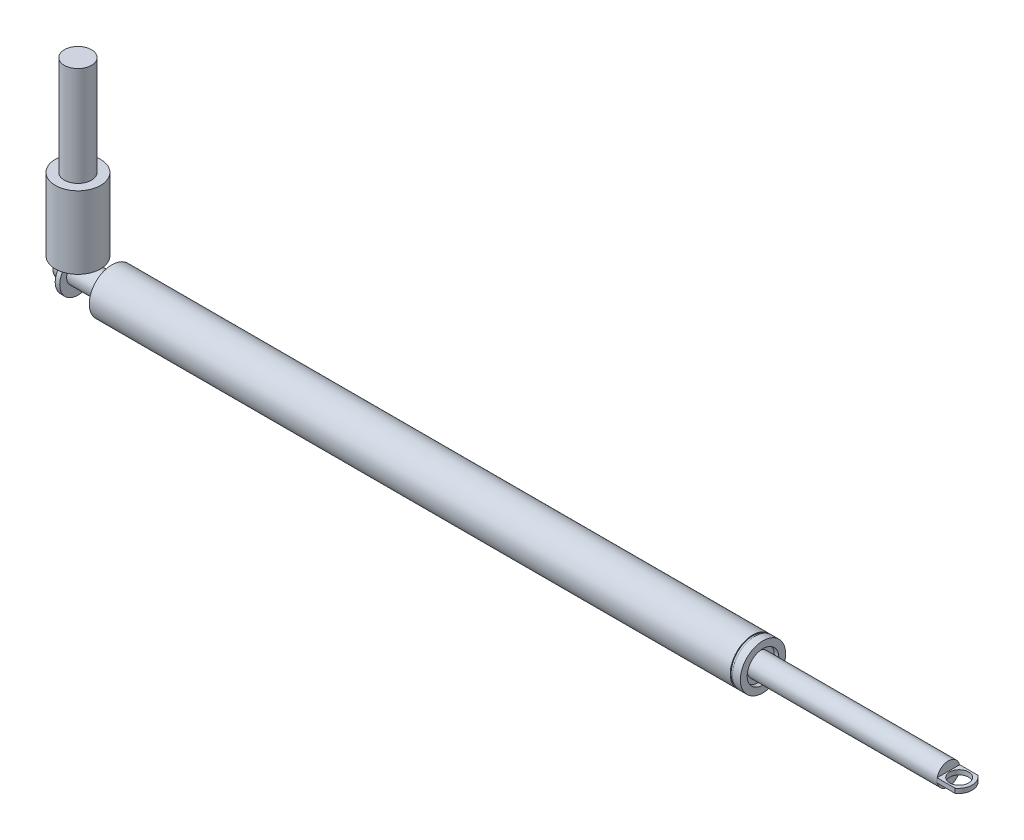
ISO-10303-21;
HEADER;
FILE_DESCRIPTION(('STEP AP214'),'2;1');
FILE_NAME('part.step','',(''),(''),'','','');
FILE_SCHEMA(('AUTOMOTIVE_DESIGN { 1 0 10303 214 1 1 1 1 }'));
ENDSEC;
DATA;
#1=APPLICATION_CONTEXT('core data for automotive mechanical design processes');
#2=APPLICATION_PROTOCOL_DEFINITION('international standard','automotive_design',2000,#1);
#3=PRODUCT_CONTEXT('',#1,'mechanical');
#4=PRODUCT('Part','Part','',(#3));
#5=PRODUCT_RELATED_PRODUCT_CATEGORY('part','',(#4));
#6=PRODUCT_DEFINITION_FORMATION('','',#4);
#7=PRODUCT_DEFINITION_CONTEXT('part definition',#1,'design');
#8=PRODUCT_DEFINITION('design','',#6,#7);
#9=PRODUCT_DEFINITION_SHAPE('','',#8);
#10=(LENGTH_UNIT() NAMED_UNIT(*) SI_UNIT(.MILLI.,.METRE.));
#11=(NAMED_UNIT(*) PLANE_ANGLE_UNIT() SI_UNIT($,.RADIAN.));
#12=(NAMED_UNIT(*) SI_UNIT($,.STERADIAN.) SOLID_ANGLE_UNIT());
#13=UNCERTAINTY_MEASURE_WITH_UNIT(LENGTH_MEASURE(1.E-05),#10,'distance_accuracy_value','');
#14=(GEOMETRIC_REPRESENTATION_CONTEXT(3) GLOBAL_UNCERTAINTY_ASSIGNED_CONTEXT((#13)) GLOBAL_UNIT_ASSIGNED_CONTEXT((#10,
#11,#12)) REPRESENTATION_CONTEXT('',''));
#15=CARTESIAN_POINT('',(0.,0.,0.));
#16=DIRECTION('',(0.,0.,1.));
#17=DIRECTION('',(1.,0.,0.));
#18=AXIS2_PLACEMENT_3D('',#15,#16,#17);
#19=CARTESIAN_POINT('',(151.5,12.,0.));
#20=DIRECTION('',(-1.,0.,0.));
#21=DIRECTION('',(0.,0.,1.));
#22=AXIS2_PLACEMENT_3D('',#19,#20,#21);
#23=CYLINDRICAL_SURFACE('',#22,5.);
#24=CARTESIAN_POINT('',(7.5,12.,0.));
#25=DIRECTION('',(1.,0.,0.));
#26=DIRECTION('',(0.,0.,-1.));
#27=AXIS2_PLACEMENT_3D('',#24,#25,#26);
#28=CIRCLE('',#27,5.);
#29=CARTESIAN_POINT('',(7.5,12.,-5.));
#30=VERTEX_POINT('',#29);
#31=EDGE_CURVE('E177',#30,#30,#28,.T.);
#32=ORIENTED_EDGE('',*,*,#31,.T.);
#33=EDGE_LOOP('',(#32));
#34=FACE_BOUND('',#33,.T.);
#35=CARTESIAN_POINT('',(149.25,12.,0.));
#36=DIRECTION('',(1.,0.,0.));
#37=DIRECTION('',(0.,0.,-1.));
#38=AXIS2_PLACEMENT_3D('',#35,#36,#37);
#39=CIRCLE('',#38,5.);
#40=CARTESIAN_POINT('',(149.25,12.,-5.));
#41=VERTEX_POINT('',#40);
#42=EDGE_CURVE('E47',#41,#41,#39,.T.);
#43=ORIENTED_EDGE('',*,*,#42,.F.);
#44=EDGE_LOOP('',(#43));
#45=FACE_BOUND('',#44,.T.);
#46=ADVANCED_FACE('F43',(#34,#45),#23,.T.);
#47=CARTESIAN_POINT('',(7.5,12.0524575726032,0.));
#48=DIRECTION('',(-1.,0.,0.));
#49=DIRECTION('',(0.,0.,1.));
#50=AXIS2_PLACEMENT_3D('',#47,#48,#49);
#51=CYLINDRICAL_SURFACE('',#50,2.5);
#52=CARTESIAN_POINT('',(7.5,12.0524575726032,0.));
#53=DIRECTION('',(1.,0.,0.));
#54=DIRECTION('',(0.,0.,-1.));
#55=AXIS2_PLACEMENT_3D('',#52,#53,#54);
#56=CIRCLE('',#55,2.5);
#57=CARTESIAN_POINT('',(7.5,12.0524575726032,-2.5));
#58=VERTEX_POINT('',#57);
#59=EDGE_CURVE('E253',#58,#58,#56,.T.);
#60=ORIENTED_EDGE('',*,*,#59,.F.);
#61=EDGE_LOOP('',(#60));
#62=FACE_BOUND('',#61,.T.);
#63=CARTESIAN_POINT('',(0.,12.0524575726032,0.));
#64=DIRECTION('',(1.,0.,0.));
#65=DIRECTION('',(0.,0.,-1.));
#66=AXIS2_PLACEMENT_3D('',#63,#64,#65);
#67=CIRCLE('',#66,2.5);
#68=CARTESIAN_POINT('',(0.,12.0524575726032,-2.5));
#69=VERTEX_POINT('',#68);
#70=EDGE_CURVE('E252',#69,#69,#67,.T.);
#71=ORIENTED_EDGE('',*,*,#70,.T.);
#72=EDGE_LOOP('',(#71));
#73=FACE_BOUND('',#72,.T.);
#74=ADVANCED_FACE('F45',(#62,#73),#51,.T.);
#75=CARTESIAN_POINT('',(0.,14.54754243,2.52885894715441));
#76=DIRECTION('',(-1.,0.,0.));
#77=DIRECTION('',(0.,0.,1.));
#78=AXIS2_PLACEMENT_3D('',#75,#76,#77);
#79=PLANE('',#78);
#80=ORIENTED_EDGE('',*,*,#70,.F.);
#81=EDGE_LOOP('',(#80));
#82=FACE_BOUND('',#81,.T.);
#83=CARTESIAN_POINT('',(0.,11.4250434308008,0.0288589471544053));
#84=DIRECTION('',(1.,0.,0.));
#85=DIRECTION('',(0.,0.,-1.));
#86=AXIS2_PLACEMENT_3D('',#83,#84,#85);
#87=CIRCLE('',#86,4.);
#88=CARTESIAN_POINT('',(0.,14.54754243,2.52885894715441));
#89=VERTEX_POINT('',#88);
#90=CARTESIAN_POINT('',(0.,14.54754243,-2.47114105284559));
#91=VERTEX_POINT('',#90);
#92=EDGE_CURVE('E192',#89,#91,#87,.T.);
#93=ORIENTED_EDGE('',*,*,#92,.T.);
#94=DIRECTION('',(0.,1.,0.));
#95=VECTOR('',#94,1.);
#96=CARTESIAN_POINT('',(0.,14.54754243,-2.47114105284559));
#97=LINE('',#96,#95);
#98=CARTESIAN_POINT('',(0.,14.94754243,-2.47114105284559));
#99=VERTEX_POINT('',#98);
#100=EDGE_CURVE('E222',#91,#99,#97,.T.);
#101=ORIENTED_EDGE('',*,*,#100,.T.);
#102=DIRECTION('',(0.,0.,1.));
#103=VECTOR('',#102,1.);
#104=CARTESIAN_POINT('',(0.,14.94754243,2.52885894715441));
#105=LINE('',#104,#103);
#106=CARTESIAN_POINT('',(0.,14.94754243,2.52885894715441));
#107=VERTEX_POINT('',#106);
#108=EDGE_CURVE('E212',#99,#107,#105,.T.);
#109=ORIENTED_EDGE('',*,*,#108,.T.);
#110=DIRECTION('',(0.,1.,0.));
#111=VECTOR('',#110,1.);
#112=CARTESIAN_POINT('',(0.,14.54754243,2.52885894715441));
#113=LINE('',#112,#111);
#114=EDGE_CURVE('E248',#89,#107,#113,.T.);
#115=ORIENTED_EDGE('',*,*,#114,.F.);
#116=EDGE_LOOP('',(#93,#101,#109,#115));
#117=FACE_BOUND('',#116,.T.);
#118=ADVANCED_FACE('F377',(#82,#117),#79,.F.);
#119=CARTESIAN_POINT('',(0.,14.54754243,2.52885894715441));
#120=DIRECTION('',(0.,0.,-1.));
#121=DIRECTION('',(-1.,0.,0.));
#122=AXIS2_PLACEMENT_3D('',#119,#120,#121);
#123=PLANE('',#122);
#124=DIRECTION('',(-1.,0.,0.));
#125=VECTOR('',#124,1.);
#126=CARTESIAN_POINT('',(0.,14.94754243,2.52885894715441));
#127=LINE('',#126,#125);
#128=CARTESIAN_POINT('',(-1.,14.94754243,2.52885894715441));
#129=VERTEX_POINT('',#128);
#130=EDGE_CURVE('E226',#107,#129,#127,.T.);
#131=ORIENTED_EDGE('',*,*,#130,.T.);
#132=DIRECTION('',(0.,1.,0.));
#133=VECTOR('',#132,1.);
#134=CARTESIAN_POINT('',(-1.,14.54754243,2.52885894715441));
#135=LINE('',#134,#133);
#136=CARTESIAN_POINT('',(-1.,14.54754243,2.52885894715441));
#137=VERTEX_POINT('',#136);
#138=EDGE_CURVE('E244',#137,#129,#135,.T.);
#139=ORIENTED_EDGE('',*,*,#138,.F.);
#140=DIRECTION('',(-1.,0.,0.));
#141=VECTOR('',#140,1.);
#142=CARTESIAN_POINT('',(0.,14.54754243,2.52885894715441));
#143=LINE('',#142,#141);
#144=EDGE_CURVE('E213',#89,#137,#143,.T.);
#145=ORIENTED_EDGE('',*,*,#144,.F.);
#146=ORIENTED_EDGE('',*,*,#114,.T.);
#147=EDGE_LOOP('',(#131,#139,#145,#146));
#148=FACE_BOUND('',#147,.T.);
#149=ADVANCED_FACE('F424',(#148),#123,.F.);
#150=CARTESIAN_POINT('',(-1.,14.54754243,2.52885894715441));
#151=DIRECTION('',(1.,0.,0.));
#152=DIRECTION('',(0.,0.,-1.));
#153=AXIS2_PLACEMENT_3D('',#150,#151,#152);
#154=PLANE('',#153);
#155=CARTESIAN_POINT('',(-1.,12.04754243,0.0288589471544055));
#156=DIRECTION('',(1.,0.,0.));
#157=DIRECTION('',(0.,0.,-1.));
#158=AXIS2_PLACEMENT_3D('',#155,#156,#157);
#159=CIRCLE('',#158,2.5);
#160=CARTESIAN_POINT('',(-0.999999999999999,12.04754243,-2.4711410528456));
#161=VERTEX_POINT('',#160);
#162=EDGE_CURVE('E257',#161,#161,#159,.F.);
#163=ORIENTED_EDGE('',*,*,#162,.F.);
#164=EDGE_LOOP('',(#163));
#165=FACE_BOUND('',#164,.T.);
#166=DIRECTION('',(0.,0.,-1.));
#167=VECTOR('',#166,1.);
#168=CARTESIAN_POINT('',(-1.,14.94754243,2.52885894715441));
#169=LINE('',#168,#167);
#170=CARTESIAN_POINT('',(-0.999999999999999,14.94754243,-2.47114105284559));
#171=VERTEX_POINT('',#170);
#172=EDGE_CURVE('E230',#129,#171,#169,.T.);
#173=ORIENTED_EDGE('',*,*,#172,.T.);
#174=DIRECTION('',(0.,1.,0.));
#175=VECTOR('',#174,1.);
#176=CARTESIAN_POINT('',(-0.999999999999999,14.54754243,-2.47114105284559));
#177=LINE('',#176,#175);
#178=CARTESIAN_POINT('',(-0.999999999999999,14.54754243,-2.47114105284559));
#179=VERTEX_POINT('',#178);
#180=EDGE_CURVE('E240',#179,#171,#177,.T.);
#181=ORIENTED_EDGE('',*,*,#180,.F.);
#182=CARTESIAN_POINT('',(-1.,11.4250434308008,0.0288589471544053));
#183=DIRECTION('',(1.,0.,0.));
#184=DIRECTION('',(0.,0.,-1.));
#185=AXIS2_PLACEMENT_3D('',#182,#183,#184);
#186=CIRCLE('',#185,4.);
#187=EDGE_CURVE('E193',#137,#179,#186,.T.);
#188=ORIENTED_EDGE('',*,*,#187,.F.);
#189=ORIENTED_EDGE('',*,*,#138,.T.);
#190=EDGE_LOOP('',(#173,#181,#188,#189));
#191=FACE_BOUND('',#190,.T.);
#192=ADVANCED_FACE('F437',(#165,#191),#154,.F.);
#193=CARTESIAN_POINT('',(-0.999999999999999,14.54754243,-2.47114105284559));
#194=DIRECTION('',(0.,0.,1.));
#195=DIRECTION('',(1.,0.,0.));
#196=AXIS2_PLACEMENT_3D('',#193,#194,#195);
#197=PLANE('',#196);
#198=DIRECTION('',(1.,0.,0.));
#199=VECTOR('',#198,1.);
#200=CARTESIAN_POINT('',(-0.999999999999999,14.94754243,-2.47114105284559));
#201=LINE('',#200,#199);
#202=EDGE_CURVE('E218',#171,#99,#201,.T.);
#203=ORIENTED_EDGE('',*,*,#202,.T.);
#204=ORIENTED_EDGE('',*,*,#100,.F.);
#205=DIRECTION('',(1.,0.,0.));
#206=VECTOR('',#205,1.);
#207=CARTESIAN_POINT('',(-0.999999999999999,14.54754243,-2.47114105284559));
#208=LINE('',#207,#206);
#209=EDGE_CURVE('E217',#179,#91,#208,.T.);
#210=ORIENTED_EDGE('',*,*,#209,.F.);
#211=ORIENTED_EDGE('',*,*,#180,.T.);
#212=EDGE_LOOP('',(#203,#204,#210,#211));
#213=FACE_BOUND('',#212,.T.);
#214=ADVANCED_FACE('F432',(#213),#197,.F.);
#215=CARTESIAN_POINT('',(0.,30.94754243,0.));
#216=DIRECTION('',(0.,1.,0.));
#217=DIRECTION('',(0.,0.,1.));
#218=AXIS2_PLACEMENT_3D('',#215,#216,#217);
#219=CYLINDRICAL_SURFACE('',#218,3.);
#220=CARTESIAN_POINT('',(0.,30.94754243,0.));
#221=DIRECTION('',(0.,1.,0.));
#222=DIRECTION('',(0.,0.,1.));
#223=AXIS2_PLACEMENT_3D('',#220,#221,#222);
#224=CIRCLE('',#223,3.);
#225=CARTESIAN_POINT('',(0.,30.94754243,3.));
#226=VERTEX_POINT('',#225);
#227=EDGE_CURVE('E205',#226,#226,#224,.T.);
#228=ORIENTED_EDGE('',*,*,#227,.T.);
#229=EDGE_LOOP('',(#228));
#230=FACE_BOUND('',#229,.T.);
#231=CARTESIAN_POINT('',(0.,52.94754243,0.));
#232=DIRECTION('',(0.,1.,0.));
#233=DIRECTION('',(0.,0.,1.));
#234=AXIS2_PLACEMENT_3D('',#231,#232,#233);
#235=CIRCLE('',#234,3.);
#236=CARTESIAN_POINT('',(0.,52.94754243,3.));
#237=VERTEX_POINT('',#236);
#238=EDGE_CURVE('E272',#237,#237,#235,.T.);
#239=ORIENTED_EDGE('',*,*,#238,.F.);
#240=EDGE_LOOP('',(#239));
#241=FACE_BOUND('',#240,.T.);
#242=ADVANCED_FACE('F449',(#230,#241),#219,.T.);
#243=CARTESIAN_POINT('',(0.,14.94754243,0.));
#244=DIRECTION('',(0.,1.,0.));
#245=DIRECTION('',(0.,0.,1.));
#246=AXIS2_PLACEMENT_3D('',#243,#244,#245);
#247=CYLINDRICAL_SURFACE('',#246,5.);
#248=CARTESIAN_POINT('',(0.,14.94754243,0.));
#249=DIRECTION('',(0.,1.,0.));
#250=DIRECTION('',(0.,0.,1.));
#251=AXIS2_PLACEMENT_3D('',#248,#249,#250);
#252=CIRCLE('',#251,5.);
#253=CARTESIAN_POINT('',(0.,14.94754243,5.));
#254=VERTEX_POINT('',#253);
#255=EDGE_CURVE('E201',#254,#254,#252,.T.);
#256=ORIENTED_EDGE('',*,*,#255,.T.);
#257=EDGE_LOOP('',(#256));
#258=FACE_BOUND('',#257,.T.);
#259=CARTESIAN_POINT('',(0.,30.94754243,0.));
#260=DIRECTION('',(0.,1.,0.));
#261=DIRECTION('',(0.,0.,1.));
#262=AXIS2_PLACEMENT_3D('',#259,#260,#261);
#263=CIRCLE('',#262,5.);
#264=CARTESIAN_POINT('',(0.,30.94754243,5.));
#265=VERTEX_POINT('',#264);
#266=EDGE_CURVE('E197',#265,#265,#263,.T.);
#267=ORIENTED_EDGE('',*,*,#266,.F.);
#268=EDGE_LOOP('',(#267));
#269=FACE_BOUND('',#268,.T.);
#270=ADVANCED_FACE('F452',(#258,#269),#247,.T.);
#271=CARTESIAN_POINT('',(0.,14.94754243,0.));
#272=DIRECTION('',(0.,1.,0.));
#273=DIRECTION('',(0.,0.,1.));
#274=AXIS2_PLACEMENT_3D('',#271,#272,#273);
#275=PLANE('',#274);
#276=ORIENTED_EDGE('',*,*,#108,.F.);
#277=ORIENTED_EDGE('',*,*,#202,.F.);
#278=ORIENTED_EDGE('',*,*,#172,.F.);
#279=ORIENTED_EDGE('',*,*,#130,.F.);
#280=EDGE_LOOP('',(#276,#277,#278,#279));
#281=FACE_BOUND('',#280,.T.);
#282=ORIENTED_EDGE('',*,*,#255,.F.);
#283=EDGE_LOOP('',(#282));
#284=FACE_BOUND('',#283,.T.);
#285=ADVANCED_FACE('F434',(#281,#284),#275,.F.);
#286=CARTESIAN_POINT('',(0.,30.94754243,0.));
#287=DIRECTION('',(0.,1.,0.));
#288=DIRECTION('',(0.,0.,1.));
#289=AXIS2_PLACEMENT_3D('',#286,#287,#288);
#290=PLANE('',#289);
#291=ORIENTED_EDGE('',*,*,#227,.F.);
#292=EDGE_LOOP('',(#291));
#293=FACE_BOUND('',#292,.T.);
#294=ORIENTED_EDGE('',*,*,#266,.T.);
#295=EDGE_LOOP('',(#294));
#296=FACE_BOUND('',#295,.T.);
#297=ADVANCED_FACE('F457',(#293,#296),#290,.T.);
#298=CARTESIAN_POINT('',(-1.,11.4250434308008,0.0288589471544053));
#299=DIRECTION('',(1.,0.,0.));
#300=DIRECTION('',(0.,0.,-1.));
#301=AXIS2_PLACEMENT_3D('',#298,#299,#300);
#302=CYLINDRICAL_SURFACE('',#301,4.);
#303=ORIENTED_EDGE('',*,*,#92,.F.);
#304=ORIENTED_EDGE('',*,*,#144,.T.);
#305=ORIENTED_EDGE('',*,*,#187,.T.);
#306=ORIENTED_EDGE('',*,*,#209,.T.);
#307=EDGE_LOOP('',(#303,#304,#305,#306));
#308=FACE_BOUND('',#307,.T.);
#309=ADVANCED_FACE('F428',(#308),#302,.T.);
#310=CARTESIAN_POINT('',(-3.,12.04754243,0.0288589471544055));
#311=DIRECTION('',(1.,0.,0.));
#312=DIRECTION('',(0.,0.,-1.));
#313=AXIS2_PLACEMENT_3D('',#310,#311,#312);
#314=CYLINDRICAL_SURFACE('',#313,2.5);
#315=CARTESIAN_POINT('',(-3.,12.04754243,0.0288589471544055));
#316=DIRECTION('',(-1.,0.,0.));
#317=DIRECTION('',(0.,0.,1.));
#318=AXIS2_PLACEMENT_3D('',#315,#316,#317);
#319=CIRCLE('',#318,2.5);
#320=CARTESIAN_POINT('',(-3.,12.04754243,2.52885894715441));
#321=VERTEX_POINT('',#320);
#322=EDGE_CURVE('E185',#321,#321,#319,.T.);
#323=ORIENTED_EDGE('',*,*,#322,.F.);
#324=EDGE_LOOP('',(#323));
#325=FACE_BOUND('',#324,.T.);
#326=ORIENTED_EDGE('',*,*,#162,.T.);
#327=EDGE_LOOP('',(#326));
#328=FACE_BOUND('',#327,.T.);
#329=ADVANCED_FACE('F414',(#325,#328),#314,.T.);
#330=CARTESIAN_POINT('',(-3.,12.04754243,0.0288589471544055));
#331=DIRECTION('',(-1.,0.,0.));
#332=DIRECTION('',(0.,0.,1.));
#333=AXIS2_PLACEMENT_3D('',#330,#331,#332);
#334=PLANE('',#333);
#335=ORIENTED_EDGE('',*,*,#322,.T.);
#336=EDGE_LOOP('',(#335));
#337=FACE_BOUND('',#336,.T.);
#338=ADVANCED_FACE('F405',(#337),#334,.T.);
#339=CARTESIAN_POINT('',(7.5,12.,0.));
#340=DIRECTION('',(1.,0.,0.));
#341=DIRECTION('',(0.,0.,-1.));
#342=AXIS2_PLACEMENT_3D('',#339,#340,#341);
#343=PLANE('',#342);
#344=ORIENTED_EDGE('',*,*,#59,.T.);
#345=EDGE_LOOP('',(#344));
#346=FACE_BOUND('',#345,.T.);
#347=ORIENTED_EDGE('',*,*,#31,.F.);
#348=EDGE_LOOP('',(#347));
#349=FACE_BOUND('',#348,.T.);
#350=ADVANCED_FACE('F403',(#346,#349),#343,.F.);
#351=CARTESIAN_POINT('',(0.,52.94754243,0.));
#352=DIRECTION('',(0.,1.,0.));
#353=DIRECTION('',(0.,0.,1.));
#354=AXIS2_PLACEMENT_3D('',#351,#352,#353);
#355=PLANE('',#354);
#356=ORIENTED_EDGE('',*,*,#238,.T.);
#357=EDGE_LOOP('',(#356));
#358=FACE_BOUND('',#357,.T.);
#359=ADVANCED_FACE('F404',(#358),#355,.T.);
#360=CARTESIAN_POINT('',(149.25,29.973771215,0.));
#361=DIRECTION('',(1.,0.,0.));
#362=DIRECTION('',(0.,0.,-1.));
#363=AXIS2_PLACEMENT_3D('',#360,#361,#362);
#364=PLANE('',#363);
#365=CARTESIAN_POINT('',(149.25,12.,0.));
#366=DIRECTION('',(1.,0.,0.));
#367=DIRECTION('',(0.,0.,-1.));
#368=AXIS2_PLACEMENT_3D('',#365,#366,#367);
#369=CIRCLE('',#368,4.8);
#370=CARTESIAN_POINT('',(149.25,12.,-4.8));
#371=VERTEX_POINT('',#370);
#372=EDGE_CURVE('E266',#371,#371,#369,.T.);
#373=ORIENTED_EDGE('',*,*,#372,.F.);
#374=EDGE_LOOP('',(#373));
#375=FACE_BOUND('',#374,.T.);
#376=ORIENTED_EDGE('',*,*,#42,.T.);
#377=EDGE_LOOP('',(#376));
#378=FACE_BOUND('',#377,.T.);
#379=ADVANCED_FACE('F410',(#375,#378),#364,.T.);
#380=CARTESIAN_POINT('',(149.75,29.973771215,0.));
#381=DIRECTION('',(1.,0.,0.));
#382=DIRECTION('',(0.,0.,-1.));
#383=AXIS2_PLACEMENT_3D('',#380,#381,#382);
#384=PLANE('',#383);
#385=CARTESIAN_POINT('',(149.75,12.,0.));
#386=DIRECTION('',(1.,0.,0.));
#387=DIRECTION('',(0.,0.,-1.));
#388=AXIS2_PLACEMENT_3D('',#385,#386,#387);
#389=CIRCLE('',#388,4.8);
#390=CARTESIAN_POINT('',(149.75,12.,-4.8));
#391=VERTEX_POINT('',#390);
#392=EDGE_CURVE('E274',#391,#391,#389,.T.);
#393=ORIENTED_EDGE('',*,*,#392,.T.);
#394=EDGE_LOOP('',(#393));
#395=FACE_BOUND('',#394,.T.);
#396=CARTESIAN_POINT('',(149.75,12.,0.));
#397=DIRECTION('',(1.,0.,0.));
#398=DIRECTION('',(0.,0.,-1.));
#399=AXIS2_PLACEMENT_3D('',#396,#397,#398);
#400=CIRCLE('',#399,5.);
#401=CARTESIAN_POINT('',(149.75,12.,-5.));
#402=VERTEX_POINT('',#401);
#403=EDGE_CURVE('E263',#402,#402,#400,.T.);
#404=ORIENTED_EDGE('',*,*,#403,.F.);
#405=EDGE_LOOP('',(#404));
#406=FACE_BOUND('',#405,.T.);
#407=ADVANCED_FACE('F654',(#395,#406),#384,.F.);
#408=CARTESIAN_POINT('',(149.25,12.,0.));
#409=DIRECTION('',(1.,0.,0.));
#410=DIRECTION('',(0.,0.,-1.));
#411=AXIS2_PLACEMENT_3D('',#408,#409,#410);
#412=CYLINDRICAL_SURFACE('',#411,4.8);
#413=ORIENTED_EDGE('',*,*,#372,.T.);
#414=EDGE_LOOP('',(#413));
#415=FACE_BOUND('',#414,.T.);
#416=ORIENTED_EDGE('',*,*,#392,.F.);
#417=EDGE_LOOP('',(#416));
#418=FACE_BOUND('',#417,.T.);
#419=ADVANCED_FACE('F624',(#415,#418),#412,.T.);
#420=CARTESIAN_POINT('',(194.882176,11.5,0.));
#421=DIRECTION('',(0.,1.,0.));
#422=DIRECTION('',(0.,0.,1.));
#423=AXIS2_PLACEMENT_3D('',#420,#421,#422);
#424=CYLINDRICAL_SURFACE('',#423,2.10321047076042);
#425=CARTESIAN_POINT('',(194.882176,11.5,0.));
#426=DIRECTION('',(0.,1.,0.));
#427=DIRECTION('',(0.,0.,1.));
#428=AXIS2_PLACEMENT_3D('',#425,#426,#427);
#429=CIRCLE('',#428,2.10321047076042);
#430=CARTESIAN_POINT('',(194.882176,11.5,2.10321047076042));
#431=VERTEX_POINT('',#430);
#432=EDGE_CURVE('E286',#431,#431,#429,.T.);
#433=ORIENTED_EDGE('',*,*,#432,.F.);
#434=EDGE_LOOP('',(#433));
#435=FACE_BOUND('',#434,.T.);
#436=CARTESIAN_POINT('',(194.882176,12.5,0.));
#437=DIRECTION('',(0.,1.,0.));
#438=DIRECTION('',(0.,0.,1.));
#439=AXIS2_PLACEMENT_3D('',#436,#437,#438);
#440=CIRCLE('',#439,2.10321047076042);
#441=CARTESIAN_POINT('',(194.882176,12.5,2.10321047076042));
#442=VERTEX_POINT('',#441);
#443=EDGE_CURVE('E285',#442,#442,#440,.T.);
#444=ORIENTED_EDGE('',*,*,#443,.T.);
#445=EDGE_LOOP('',(#444));
#446=FACE_BOUND('',#445,.T.);
#447=ADVANCED_FACE('F588',(#435,#446),#424,.F.);
#448=CARTESIAN_POINT('',(194.66749091317,12.5,0.));
#449=DIRECTION('',(0.,-1.,0.));
#450=DIRECTION('',(0.,0.,-1.));
#451=AXIS2_PLACEMENT_3D('',#448,#449,#450);
#452=CYLINDRICAL_SURFACE('',#451,3.09969184812235);
#453=CARTESIAN_POINT('',(194.66749091317,11.5,0.));
#454=DIRECTION('',(0.,1.,0.));
#455=DIRECTION('',(0.,0.,-1.));
#456=AXIS2_PLACEMENT_3D('',#453,#454,#455);
#457=CIRCLE('',#456,3.09969184812235);
#458=CARTESIAN_POINT('',(196.5,11.5,2.5));
#459=VERTEX_POINT('',#458);
#460=CARTESIAN_POINT('',(196.5,11.5,-2.5));
#461=VERTEX_POINT('',#460);
#462=EDGE_CURVE('E305',#459,#461,#457,.T.);
#463=ORIENTED_EDGE('',*,*,#462,.T.);
#464=DIRECTION('',(0.,-1.,0.));
#465=VECTOR('',#464,1.);
#466=CARTESIAN_POINT('',(196.5,12.5,-2.5));
#467=LINE('',#466,#465);
#468=CARTESIAN_POINT('',(196.5,12.5,-2.5));
#469=VERTEX_POINT('',#468);
#470=EDGE_CURVE('E314',#469,#461,#467,.T.);
#471=ORIENTED_EDGE('',*,*,#470,.F.);
#472=CARTESIAN_POINT('',(194.66749091317,12.5,0.));
#473=DIRECTION('',(0.,1.,0.));
#474=DIRECTION('',(0.,0.,-1.));
#475=AXIS2_PLACEMENT_3D('',#472,#473,#474);
#476=CIRCLE('',#475,3.09969184812235);
#477=CARTESIAN_POINT('',(196.5,12.5,2.5));
#478=VERTEX_POINT('',#477);
#479=EDGE_CURVE('E150',#478,#469,#476,.T.);
#480=ORIENTED_EDGE('',*,*,#479,.F.);
#481=DIRECTION('',(0.,-1.,0.));
#482=VECTOR('',#481,1.);
#483=CARTESIAN_POINT('',(196.5,12.5,2.5));
#484=LINE('',#483,#482);
#485=EDGE_CURVE('E147',#478,#459,#484,.T.);
#486=ORIENTED_EDGE('',*,*,#485,.T.);
#487=EDGE_LOOP('',(#463,#471,#480,#486));
#488=FACE_BOUND('',#487,.T.);
#489=ADVANCED_FACE('F324',(#488),#452,.T.);
#490=CARTESIAN_POINT('',(192.5,12.5,2.5));
#491=DIRECTION('',(0.,0.,-1.));
#492=DIRECTION('',(-1.,0.,0.));
#493=AXIS2_PLACEMENT_3D('',#490,#491,#492);
#494=PLANE('',#493);
#495=DIRECTION('',(1.,0.,0.));
#496=VECTOR('',#495,1.);
#497=CARTESIAN_POINT('',(192.5,11.5,2.5));
#498=LINE('',#497,#496);
#499=CARTESIAN_POINT('',(192.5,11.5,2.5));
#500=VERTEX_POINT('',#499);
#501=EDGE_CURVE('E302',#500,#459,#498,.T.);
#502=ORIENTED_EDGE('',*,*,#501,.T.);
#503=ORIENTED_EDGE('',*,*,#485,.F.);
#504=DIRECTION('',(1.,0.,0.));
#505=VECTOR('',#504,1.);
#506=CARTESIAN_POINT('',(192.5,12.5,2.5));
#507=LINE('',#506,#505);
#508=CARTESIAN_POINT('',(192.5,12.5,2.5));
#509=VERTEX_POINT('',#508);
#510=EDGE_CURVE('E133',#509,#478,#507,.T.);
#511=ORIENTED_EDGE('',*,*,#510,.F.);
#512=DIRECTION('',(0.,-1.,0.));
#513=VECTOR('',#512,1.);
#514=CARTESIAN_POINT('',(192.5,12.5,2.5));
#515=LINE('',#514,#513);
#516=CARTESIAN_POINT('',(192.5,12.,2.5));
#517=VERTEX_POINT('',#516);
#518=EDGE_CURVE('E145',#509,#517,#515,.T.);
#519=ORIENTED_EDGE('',*,*,#518,.T.);
#520=EDGE_CURVE('E158',#517,#500,#515,.T.);
#521=ORIENTED_EDGE('',*,*,#520,.T.);
#522=EDGE_LOOP('',(#502,#503,#511,#519,#521));
#523=FACE_BOUND('',#522,.T.);
#524=ADVANCED_FACE('F144',(#523),#494,.F.);
#525=CARTESIAN_POINT('',(194.66749091317,11.5,0.));
#526=DIRECTION('',(0.,-1.,0.));
#527=DIRECTION('',(0.,0.,-1.));
#528=AXIS2_PLACEMENT_3D('',#525,#526,#527);
#529=PLANE('',#528);
#530=ORIENTED_EDGE('',*,*,#432,.T.);
#531=EDGE_LOOP('',(#530));
#532=FACE_BOUND('',#531,.T.);
#533=DIRECTION('',(0.,0.,1.));
#534=VECTOR('',#533,1.);
#535=CARTESIAN_POINT('',(192.5,11.5,-2.5));
#536=LINE('',#535,#534);
#537=CARTESIAN_POINT('',(192.5,11.5,-2.5));
#538=VERTEX_POINT('',#537);
#539=CARTESIAN_POINT('',(192.5,11.5,-2.44948974278318));
#540=VERTEX_POINT('',#539);
#541=EDGE_CURVE('E55',#538,#540,#536,.T.);
#542=ORIENTED_EDGE('',*,*,#541,.F.);
#543=DIRECTION('',(-1.,0.,0.));
#544=VECTOR('',#543,1.);
#545=CARTESIAN_POINT('',(192.5,11.5,-2.5));
#546=LINE('',#545,#544);
#547=EDGE_CURVE('E140',#461,#538,#546,.T.);
#548=ORIENTED_EDGE('',*,*,#547,.F.);
#549=ORIENTED_EDGE('',*,*,#462,.F.);
#550=ORIENTED_EDGE('',*,*,#501,.F.);
#551=CARTESIAN_POINT('',(192.5,11.5,2.44948974278318));
#552=VERTEX_POINT('',#551);
#553=EDGE_CURVE('E56',#552,#500,#536,.T.);
#554=ORIENTED_EDGE('',*,*,#553,.F.);
#555=EDGE_CURVE('E12',#540,#552,#536,.T.);
#556=ORIENTED_EDGE('',*,*,#555,.F.);
#557=EDGE_LOOP('',(#542,#548,#549,#550,#554,#556));
#558=FACE_BOUND('',#557,.T.);
#559=ADVANCED_FACE('F328',(#532,#558),#529,.T.);
#560=CARTESIAN_POINT('',(194.66749091317,12.5,0.));
#561=DIRECTION('',(0.,-1.,0.));
#562=DIRECTION('',(0.,0.,-1.));
#563=AXIS2_PLACEMENT_3D('',#560,#561,#562);
#564=PLANE('',#563);
#565=ORIENTED_EDGE('',*,*,#443,.F.);
#566=EDGE_LOOP('',(#565));
#567=FACE_BOUND('',#566,.T.);
#568=DIRECTION('',(0.,0.,1.));
#569=VECTOR('',#568,1.);
#570=CARTESIAN_POINT('',(192.5,12.5,-2.5));
#571=LINE('',#570,#569);
#572=CARTESIAN_POINT('',(192.5,12.5,-2.5));
#573=VERTEX_POINT('',#572);
#574=CARTESIAN_POINT('',(192.5,12.5,-2.44948974278318));
#575=VERTEX_POINT('',#574);
#576=EDGE_CURVE('E139',#573,#575,#571,.T.);
#577=ORIENTED_EDGE('',*,*,#576,.T.);
#578=CARTESIAN_POINT('',(192.5,12.5,2.44948974278318));
#579=VERTEX_POINT('',#578);
#580=EDGE_CURVE('E53',#575,#579,#571,.T.);
#581=ORIENTED_EDGE('',*,*,#580,.T.);
#582=EDGE_CURVE('E129',#579,#509,#571,.T.);
#583=ORIENTED_EDGE('',*,*,#582,.T.);
#584=ORIENTED_EDGE('',*,*,#510,.T.);
#585=ORIENTED_EDGE('',*,*,#479,.T.);
#586=DIRECTION('',(-1.,0.,0.));
#587=VECTOR('',#586,1.);
#588=CARTESIAN_POINT('',(192.5,12.5,-2.5));
#589=LINE('',#588,#587);
#590=EDGE_CURVE('E296',#469,#573,#589,.T.);
#591=ORIENTED_EDGE('',*,*,#590,.T.);
#592=EDGE_LOOP('',(#577,#581,#583,#584,#585,#591));
#593=FACE_BOUND('',#592,.T.);
#594=ADVANCED_FACE('F132',(#567,#593),#564,.F.);
#595=CARTESIAN_POINT('',(192.5,12.5,-2.5));
#596=DIRECTION('',(0.,0.,1.));
#597=DIRECTION('',(1.,0.,0.));
#598=AXIS2_PLACEMENT_3D('',#595,#596,#597);
#599=PLANE('',#598);
#600=ORIENTED_EDGE('',*,*,#547,.T.);
#601=DIRECTION('',(0.,-1.,0.));
#602=VECTOR('',#601,1.);
#603=CARTESIAN_POINT('',(192.5,12.5,-2.5));
#604=LINE('',#603,#602);
#605=CARTESIAN_POINT('',(192.5,12.,-2.5));
#606=VERTEX_POINT('',#605);
#607=EDGE_CURVE('E298',#606,#538,#604,.T.);
#608=ORIENTED_EDGE('',*,*,#607,.F.);
#609=EDGE_CURVE('E311',#573,#606,#604,.T.);
#610=ORIENTED_EDGE('',*,*,#609,.F.);
#611=ORIENTED_EDGE('',*,*,#590,.F.);
#612=ORIENTED_EDGE('',*,*,#470,.T.);
#613=EDGE_LOOP('',(#600,#608,#610,#611,#612));
#614=FACE_BOUND('',#613,.T.);
#615=ADVANCED_FACE('F331',(#614),#599,.F.);
#616=CARTESIAN_POINT('',(192.5,12.,0.));
#617=DIRECTION('',(1.,0.,0.));
#618=DIRECTION('',(0.,0.,-1.));
#619=AXIS2_PLACEMENT_3D('',#616,#617,#618);
#620=PLANE('',#619);
#621=ORIENTED_EDGE('',*,*,#580,.F.);
#622=CARTESIAN_POINT('',(192.5,12.,0.));
#623=DIRECTION('',(1.,0.,0.));
#624=DIRECTION('',(0.,0.,-1.));
#625=AXIS2_PLACEMENT_3D('',#622,#623,#624);
#626=CIRCLE('',#625,2.5);
#627=EDGE_CURVE('E171',#575,#579,#626,.T.);
#628=ORIENTED_EDGE('',*,*,#627,.T.);
#629=EDGE_LOOP('',(#621,#628));
#630=FACE_BOUND('',#629,.T.);
#631=ADVANCED_FACE('F353',(#630),#620,.T.);
#632=CARTESIAN_POINT('',(192.5,12.5,-2.5));
#633=DIRECTION('',(1.,0.,0.));
#634=DIRECTION('',(0.,0.,-1.));
#635=AXIS2_PLACEMENT_3D('',#632,#633,#634);
#636=PLANE('',#635);
#637=ORIENTED_EDGE('',*,*,#582,.F.);
#638=EDGE_CURVE('E154',#579,#517,#626,.T.);
#639=ORIENTED_EDGE('',*,*,#638,.T.);
#640=ORIENTED_EDGE('',*,*,#518,.F.);
#641=EDGE_LOOP('',(#637,#639,#640));
#642=FACE_BOUND('',#641,.T.);
#643=ADVANCED_FACE('F152',(#642),#636,.F.);
#644=ORIENTED_EDGE('',*,*,#520,.F.);
#645=EDGE_CURVE('E345',#517,#552,#626,.T.);
#646=ORIENTED_EDGE('',*,*,#645,.T.);
#647=ORIENTED_EDGE('',*,*,#553,.T.);
#648=EDGE_LOOP('',(#644,#646,#647));
#649=FACE_BOUND('',#648,.T.);
#650=ADVANCED_FACE('F362',(#649),#636,.F.);
#651=EDGE_CURVE('E343',#552,#540,#626,.T.);
#652=ORIENTED_EDGE('',*,*,#651,.T.);
#653=ORIENTED_EDGE('',*,*,#555,.T.);
#654=EDGE_LOOP('',(#652,#653));
#655=FACE_BOUND('',#654,.T.);
#656=ADVANCED_FACE('F357',(#655),#620,.T.);
#657=ORIENTED_EDGE('',*,*,#541,.T.);
#658=EDGE_CURVE('E63',#540,#606,#626,.T.);
#659=ORIENTED_EDGE('',*,*,#658,.T.);
#660=ORIENTED_EDGE('',*,*,#607,.T.);
#661=EDGE_LOOP('',(#657,#659,#660));
#662=FACE_BOUND('',#661,.T.);
#663=ADVANCED_FACE('F341',(#662),#636,.F.);
#664=ORIENTED_EDGE('',*,*,#609,.T.);
#665=EDGE_CURVE('E167',#606,#575,#626,.T.);
#666=ORIENTED_EDGE('',*,*,#665,.T.);
#667=ORIENTED_EDGE('',*,*,#576,.F.);
#668=EDGE_LOOP('',(#664,#666,#667));
#669=FACE_BOUND('',#668,.T.);
#670=ADVANCED_FACE('F337',(#669),#636,.F.);
#671=CARTESIAN_POINT('',(192.5,12.,0.));
#672=DIRECTION('',(-1.,0.,0.));
#673=DIRECTION('',(0.,0.,1.));
#674=AXIS2_PLACEMENT_3D('',#671,#672,#673);
#675=CYLINDRICAL_SURFACE('',#674,2.5);
#676=ORIENTED_EDGE('',*,*,#665,.F.);
#677=ORIENTED_EDGE('',*,*,#658,.F.);
#678=ORIENTED_EDGE('',*,*,#651,.F.);
#679=ORIENTED_EDGE('',*,*,#645,.F.);
#680=ORIENTED_EDGE('',*,*,#638,.F.);
#681=ORIENTED_EDGE('',*,*,#627,.F.);
#682=EDGE_LOOP('',(#676,#677,#678,#679,#680,#681));
#683=FACE_BOUND('',#682,.T.);
#684=CARTESIAN_POINT('',(150.5,12.,0.));
#685=DIRECTION('',(1.,0.,0.));
#686=DIRECTION('',(0.,0.,-1.));
#687=AXIS2_PLACEMENT_3D('',#684,#685,#686);
#688=CIRCLE('',#687,2.5);
#689=CARTESIAN_POINT('',(150.5,12.,-2.5));
#690=VERTEX_POINT('',#689);
#691=EDGE_CURVE('E157',#690,#690,#688,.T.);
#692=ORIENTED_EDGE('',*,*,#691,.T.);
#693=EDGE_LOOP('',(#692));
#694=FACE_BOUND('',#693,.T.);
#695=ADVANCED_FACE('F339',(#683,#694),#675,.T.);
#696=CARTESIAN_POINT('',(150.5,12.,0.));
#697=DIRECTION('',(1.,0.,0.));
#698=DIRECTION('',(0.,0.,-1.));
#699=AXIS2_PLACEMENT_3D('',#696,#697,#698);
#700=PLANE('',#699);
#701=ORIENTED_EDGE('',*,*,#691,.F.);
#702=EDGE_LOOP('',(#701));
#703=FACE_BOUND('',#702,.T.);
#704=CARTESIAN_POINT('',(150.5,12.,0.));
#705=DIRECTION('',(1.,0.,0.));
#706=DIRECTION('',(0.,0.,-1.));
#707=AXIS2_PLACEMENT_3D('',#704,#705,#706);
#708=CIRCLE('',#707,3.5);
#709=CARTESIAN_POINT('',(150.5,12.,-3.5));
#710=VERTEX_POINT('',#709);
#711=EDGE_CURVE('E173',#710,#710,#708,.T.);
#712=ORIENTED_EDGE('',*,*,#711,.T.);
#713=EDGE_LOOP('',(#712));
#714=FACE_BOUND('',#713,.T.);
#715=ADVANCED_FACE('F398',(#703,#714),#700,.T.);
#716=CARTESIAN_POINT('',(150.5,12.,0.));
#717=DIRECTION('',(1.,0.,0.));
#718=DIRECTION('',(0.,0.,-1.));
#719=AXIS2_PLACEMENT_3D('',#716,#717,#718);
#720=CYLINDRICAL_SURFACE('',#719,3.5);
#721=ORIENTED_EDGE('',*,*,#711,.F.);
#722=EDGE_LOOP('',(#721));
#723=FACE_BOUND('',#722,.T.);
#724=CARTESIAN_POINT('',(151.5,12.,0.));
#725=DIRECTION('',(1.,0.,0.));
#726=DIRECTION('',(0.,0.,-1.));
#727=AXIS2_PLACEMENT_3D('',#724,#725,#726);
#728=CIRCLE('',#727,3.5);
#729=CARTESIAN_POINT('',(151.5,12.,-3.5));
#730=VERTEX_POINT('',#729);
#731=EDGE_CURVE('E170',#730,#730,#728,.T.);
#732=ORIENTED_EDGE('',*,*,#731,.T.);
#733=EDGE_LOOP('',(#732));
#734=FACE_BOUND('',#733,.T.);
#735=ADVANCED_FACE('F388',(#723,#734),#720,.F.);
#736=CARTESIAN_POINT('',(151.5,12.,0.));
#737=DIRECTION('',(1.,0.,0.));
#738=DIRECTION('',(0.,0.,-1.));
#739=AXIS2_PLACEMENT_3D('',#736,#737,#738);
#740=PLANE('',#739);
#741=ORIENTED_EDGE('',*,*,#731,.F.);
#742=EDGE_LOOP('',(#741));
#743=FACE_BOUND('',#742,.T.);
#744=CARTESIAN_POINT('',(151.5,12.,0.));
#745=DIRECTION('',(1.,0.,0.));
#746=DIRECTION('',(0.,0.,-1.));
#747=AXIS2_PLACEMENT_3D('',#744,#745,#746);
#748=CIRCLE('',#747,5.);
#749=CARTESIAN_POINT('',(151.5,12.,-5.));
#750=VERTEX_POINT('',#749);
#751=EDGE_CURVE('E181',#750,#750,#748,.T.);
#752=ORIENTED_EDGE('',*,*,#751,.T.);
#753=EDGE_LOOP('',(#752));
#754=FACE_BOUND('',#753,.T.);
#755=ADVANCED_FACE('F383',(#743,#754),#740,.T.);
#756=ORIENTED_EDGE('',*,*,#403,.T.);
#757=EDGE_LOOP('',(#756));
#758=FACE_BOUND('',#757,.T.);
#759=ORIENTED_EDGE('',*,*,#751,.F.);
#760=EDGE_LOOP('',(#759));
#761=FACE_BOUND('',#760,.T.);
#762=ADVANCED_FACE('F371',(#758,#761),#23,.T.);
#763=CLOSED_SHELL('',(#46,#74,#118,#149,#192,#214,#242,#270,#285,#297,#309,#329,#338,#350,#359,
#379,#407,#419,#447,#489,#524,#559,#594,#615,#631,#643,#650,#656,#663,#670,#695,#715,#735,#755,#762));
#764=MANIFOLD_SOLID_BREP('B2',#763);
#765=ADVANCED_BREP_SHAPE_REPRESENTATION('',(#18,#764),#14);
#766=SHAPE_DEFINITION_REPRESENTATION(#9,#765);
ENDSEC;
END-ISO-10303-21;
